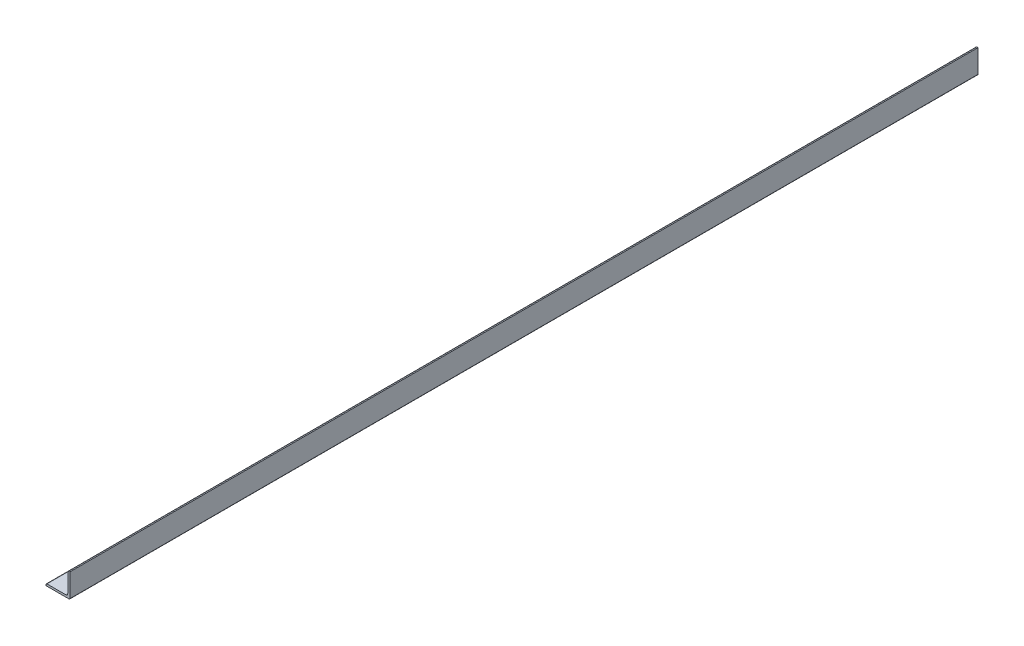
ISO-10303-21;
HEADER;
FILE_DESCRIPTION(('STEP AP214'),'2;1');
FILE_NAME('part.step','',(''),(''),'','','');
FILE_SCHEMA(('AUTOMOTIVE_DESIGN { 1 0 10303 214 1 1 1 1 }'));
ENDSEC;
DATA;
#1=APPLICATION_CONTEXT('core data for automotive mechanical design processes');
#2=APPLICATION_PROTOCOL_DEFINITION('international standard','automotive_design',2000,#1);
#3=PRODUCT_CONTEXT('',#1,'mechanical');
#4=PRODUCT('Part','Part','',(#3));
#5=PRODUCT_RELATED_PRODUCT_CATEGORY('part','',(#4));
#6=PRODUCT_DEFINITION_FORMATION('','',#4);
#7=PRODUCT_DEFINITION_CONTEXT('part definition',#1,'design');
#8=PRODUCT_DEFINITION('design','',#6,#7);
#9=PRODUCT_DEFINITION_SHAPE('','',#8);
#10=(LENGTH_UNIT() NAMED_UNIT(*) SI_UNIT(.MILLI.,.METRE.));
#11=(NAMED_UNIT(*) PLANE_ANGLE_UNIT() SI_UNIT($,.RADIAN.));
#12=(NAMED_UNIT(*) SI_UNIT($,.STERADIAN.) SOLID_ANGLE_UNIT());
#13=UNCERTAINTY_MEASURE_WITH_UNIT(LENGTH_MEASURE(1.E-05),#10,'distance_accuracy_value','');
#14=(GEOMETRIC_REPRESENTATION_CONTEXT(3) GLOBAL_UNCERTAINTY_ASSIGNED_CONTEXT((#13)) GLOBAL_UNIT_ASSIGNED_CONTEXT((#10,
#11,#12)) REPRESENTATION_CONTEXT('',''));
#15=CARTESIAN_POINT('',(0.,0.,0.));
#16=DIRECTION('',(0.,0.,1.));
#17=DIRECTION('',(1.,0.,0.));
#18=AXIS2_PLACEMENT_3D('',#15,#16,#17);
#19=CARTESIAN_POINT('',(0.,0.,668.));
#20=DIRECTION('',(0.,-1.,0.));
#21=DIRECTION('',(1.,0.,0.));
#22=AXIS2_PLACEMENT_3D('',#19,#20,#21);
#23=PLANE('',#22);
#24=DIRECTION('',(0.,0.,-1.));
#25=VECTOR('',#24,1.);
#26=CARTESIAN_POINT('',(-35.,0.,668.));
#27=LINE('',#26,#25);
#28=CARTESIAN_POINT('',(-35.,0.,668.));
#29=VERTEX_POINT('',#28);
#30=CARTESIAN_POINT('',(-35.,0.,-668.));
#31=VERTEX_POINT('',#30);
#32=EDGE_CURVE('E135',#29,#31,#27,.T.);
#33=ORIENTED_EDGE('',*,*,#32,.T.);
#34=DIRECTION('',(-1.,0.,0.));
#35=VECTOR('',#34,1.);
#36=CARTESIAN_POINT('',(0.,0.,-668.));
#37=LINE('',#36,#35);
#38=CARTESIAN_POINT('',(-1.00000000000001,0.,-668.));
#39=VERTEX_POINT('',#38);
#40=EDGE_CURVE('E129',#39,#31,#37,.T.);
#41=ORIENTED_EDGE('',*,*,#40,.F.);
#42=DIRECTION('',(0.,0.,-1.));
#43=VECTOR('',#42,1.);
#44=CARTESIAN_POINT('',(-1.00000000000001,0.,668.));
#45=LINE('',#44,#43);
#46=CARTESIAN_POINT('',(-1.00000000000001,0.,668.));
#47=VERTEX_POINT('',#46);
#48=EDGE_CURVE('E110',#47,#39,#45,.T.);
#49=ORIENTED_EDGE('',*,*,#48,.F.);
#50=DIRECTION('',(-1.,0.,0.));
#51=VECTOR('',#50,1.);
#52=CARTESIAN_POINT('',(0.,0.,668.));
#53=LINE('',#52,#51);
#54=EDGE_CURVE('E159',#47,#29,#53,.T.);
#55=ORIENTED_EDGE('',*,*,#54,.T.);
#56=EDGE_LOOP('',(#33,#41,#49,#55));
#57=FACE_BOUND('',#56,.T.);
#58=ADVANCED_FACE('F34',(#57),#23,.T.);
#59=CARTESIAN_POINT('',(-1.,1.,668.));
#60=DIRECTION('',(0.,0.,-1.));
#61=DIRECTION('',(-1.,0.,0.));
#62=AXIS2_PLACEMENT_3D('',#59,#60,#61);
#63=CYLINDRICAL_SURFACE('',#62,1.);
#64=ORIENTED_EDGE('',*,*,#48,.T.);
#65=CARTESIAN_POINT('',(-1.,1.,-668.));
#66=DIRECTION('',(0.,0.,1.));
#67=DIRECTION('',(1.,0.,0.));
#68=AXIS2_PLACEMENT_3D('',#65,#66,#67);
#69=CIRCLE('',#68,1.);
#70=CARTESIAN_POINT('',(0.,1.00000000000001,-668.));
#71=VERTEX_POINT('',#70);
#72=EDGE_CURVE('E114',#39,#71,#69,.T.);
#73=ORIENTED_EDGE('',*,*,#72,.T.);
#74=DIRECTION('',(0.,0.,-1.));
#75=VECTOR('',#74,1.);
#76=CARTESIAN_POINT('',(0.,1.00000000000001,668.));
#77=LINE('',#76,#75);
#78=CARTESIAN_POINT('',(0.,1.00000000000001,668.));
#79=VERTEX_POINT('',#78);
#80=EDGE_CURVE('E121',#79,#71,#77,.T.);
#81=ORIENTED_EDGE('',*,*,#80,.F.);
#82=CARTESIAN_POINT('',(-1.,1.,668.));
#83=DIRECTION('',(0.,0.,1.));
#84=DIRECTION('',(1.,0.,0.));
#85=AXIS2_PLACEMENT_3D('',#82,#83,#84);
#86=CIRCLE('',#85,1.);
#87=EDGE_CURVE('E115',#47,#79,#86,.T.);
#88=ORIENTED_EDGE('',*,*,#87,.F.);
#89=EDGE_LOOP('',(#64,#73,#81,#88));
#90=FACE_BOUND('',#89,.T.);
#91=ADVANCED_FACE('F112',(#90),#63,.T.);
#92=CARTESIAN_POINT('',(0.,0.,668.));
#93=DIRECTION('',(-1.,0.,0.));
#94=DIRECTION('',(0.,0.,1.));
#95=AXIS2_PLACEMENT_3D('',#92,#93,#94);
#96=PLANE('',#95);
#97=ORIENTED_EDGE('',*,*,#80,.T.);
#98=DIRECTION('',(0.,1.,0.));
#99=VECTOR('',#98,1.);
#100=CARTESIAN_POINT('',(0.,0.,-668.));
#101=LINE('',#100,#99);
#102=CARTESIAN_POINT('',(0.,35.,-668.));
#103=VERTEX_POINT('',#102);
#104=EDGE_CURVE('E132',#71,#103,#101,.T.);
#105=ORIENTED_EDGE('',*,*,#104,.T.);
#106=DIRECTION('',(0.,0.,-1.));
#107=VECTOR('',#106,1.);
#108=CARTESIAN_POINT('',(0.,35.,668.));
#109=LINE('',#108,#107);
#110=CARTESIAN_POINT('',(0.,35.,668.));
#111=VERTEX_POINT('',#110);
#112=EDGE_CURVE('E181',#111,#103,#109,.T.);
#113=ORIENTED_EDGE('',*,*,#112,.F.);
#114=DIRECTION('',(0.,1.,0.));
#115=VECTOR('',#114,1.);
#116=CARTESIAN_POINT('',(0.,0.,668.));
#117=LINE('',#116,#115);
#118=EDGE_CURVE('E162',#79,#111,#117,.T.);
#119=ORIENTED_EDGE('',*,*,#118,.F.);
#120=EDGE_LOOP('',(#97,#105,#113,#119));
#121=FACE_BOUND('',#120,.T.);
#122=ADVANCED_FACE('F222',(#121),#96,.F.);
#123=CARTESIAN_POINT('',(0.,35.,668.));
#124=DIRECTION('',(0.,1.,0.));
#125=DIRECTION('',(0.,0.,1.));
#126=AXIS2_PLACEMENT_3D('',#123,#124,#125);
#127=PLANE('',#126);
#128=ORIENTED_EDGE('',*,*,#112,.T.);
#129=DIRECTION('',(1.,0.,0.));
#130=VECTOR('',#129,1.);
#131=CARTESIAN_POINT('',(0.,35.,-668.));
#132=LINE('',#131,#130);
#133=CARTESIAN_POINT('',(-1.5,35.,-668.));
#134=VERTEX_POINT('',#133);
#135=EDGE_CURVE('E140',#134,#103,#132,.T.);
#136=ORIENTED_EDGE('',*,*,#135,.F.);
#137=DIRECTION('',(0.,0.,-1.));
#138=VECTOR('',#137,1.);
#139=CARTESIAN_POINT('',(-1.5,35.,668.));
#140=LINE('',#139,#138);
#141=CARTESIAN_POINT('',(-1.5,35.,668.));
#142=VERTEX_POINT('',#141);
#143=EDGE_CURVE('E11',#134,#142,#140,.F.);
#144=ORIENTED_EDGE('',*,*,#143,.T.);
#145=DIRECTION('',(1.,0.,0.));
#146=VECTOR('',#145,1.);
#147=CARTESIAN_POINT('',(0.,35.,668.));
#148=LINE('',#147,#146);
#149=EDGE_CURVE('E165',#142,#111,#148,.T.);
#150=ORIENTED_EDGE('',*,*,#149,.T.);
#151=EDGE_LOOP('',(#128,#136,#144,#150));
#152=FACE_BOUND('',#151,.T.);
#153=ADVANCED_FACE('F227',(#152),#127,.T.);
#154=CARTESIAN_POINT('',(-3.,0.,668.));
#155=DIRECTION('',(-1.,0.,0.));
#156=DIRECTION('',(0.,-1.,0.));
#157=AXIS2_PLACEMENT_3D('',#154,#155,#156);
#158=PLANE('',#157);
#159=DIRECTION('',(0.,1.,0.));
#160=VECTOR('',#159,1.);
#161=CARTESIAN_POINT('',(-3.,0.,668.));
#162=LINE('',#161,#160);
#163=CARTESIAN_POINT('',(-3.,6.00000000000002,668.));
#164=VERTEX_POINT('',#163);
#165=CARTESIAN_POINT('',(-3.,33.5,668.));
#166=VERTEX_POINT('',#165);
#167=EDGE_CURVE('E167',#164,#166,#162,.T.);
#168=ORIENTED_EDGE('',*,*,#167,.T.);
#169=DIRECTION('',(0.,0.,-1.));
#170=VECTOR('',#169,1.);
#171=CARTESIAN_POINT('',(-3.,33.5,668.));
#172=LINE('',#171,#170);
#173=CARTESIAN_POINT('',(-3.,33.5,-668.));
#174=VERTEX_POINT('',#173);
#175=EDGE_CURVE('E42',#166,#174,#172,.T.);
#176=ORIENTED_EDGE('',*,*,#175,.T.);
#177=DIRECTION('',(0.,1.,0.));
#178=VECTOR('',#177,1.);
#179=CARTESIAN_POINT('',(-3.,0.,-668.));
#180=LINE('',#179,#178);
#181=CARTESIAN_POINT('',(-3.,6.00000000000002,-668.));
#182=VERTEX_POINT('',#181);
#183=EDGE_CURVE('E142',#182,#174,#180,.T.);
#184=ORIENTED_EDGE('',*,*,#183,.F.);
#185=DIRECTION('',(0.,0.,-1.));
#186=VECTOR('',#185,1.);
#187=CARTESIAN_POINT('',(-3.,6.00000000000002,668.));
#188=LINE('',#187,#186);
#189=EDGE_CURVE('E179',#164,#182,#188,.T.);
#190=ORIENTED_EDGE('',*,*,#189,.F.);
#191=EDGE_LOOP('',(#168,#176,#184,#190));
#192=FACE_BOUND('',#191,.T.);
#193=ADVANCED_FACE('F192',(#192),#158,.T.);
#194=CARTESIAN_POINT('',(-6.,6.,668.));
#195=DIRECTION('',(0.,0.,-1.));
#196=DIRECTION('',(-1.,0.,0.));
#197=AXIS2_PLACEMENT_3D('',#194,#195,#196);
#198=CYLINDRICAL_SURFACE('',#197,3.);
#199=ORIENTED_EDGE('',*,*,#189,.T.);
#200=CARTESIAN_POINT('',(-6.,6.,-668.));
#201=DIRECTION('',(0.,0.,1.));
#202=DIRECTION('',(1.,0.,0.));
#203=AXIS2_PLACEMENT_3D('',#200,#201,#202);
#204=CIRCLE('',#203,3.);
#205=CARTESIAN_POINT('',(-6.00000000000002,3.,-668.));
#206=VERTEX_POINT('',#205);
#207=EDGE_CURVE('E145',#182,#206,#204,.F.);
#208=ORIENTED_EDGE('',*,*,#207,.T.);
#209=DIRECTION('',(0.,0.,-1.));
#210=VECTOR('',#209,1.);
#211=CARTESIAN_POINT('',(-6.00000000000002,3.,668.));
#212=LINE('',#211,#210);
#213=CARTESIAN_POINT('',(-6.00000000000002,3.,668.));
#214=VERTEX_POINT('',#213);
#215=EDGE_CURVE('E177',#214,#206,#212,.T.);
#216=ORIENTED_EDGE('',*,*,#215,.F.);
#217=CARTESIAN_POINT('',(-6.,6.,668.));
#218=DIRECTION('',(0.,0.,1.));
#219=DIRECTION('',(1.,0.,0.));
#220=AXIS2_PLACEMENT_3D('',#217,#218,#219);
#221=CIRCLE('',#220,3.);
#222=EDGE_CURVE('E169',#164,#214,#221,.F.);
#223=ORIENTED_EDGE('',*,*,#222,.F.);
#224=EDGE_LOOP('',(#199,#208,#216,#223));
#225=FACE_BOUND('',#224,.T.);
#226=ADVANCED_FACE('F199',(#225),#198,.F.);
#227=CARTESIAN_POINT('',(0.,3.,668.));
#228=DIRECTION('',(0.,-1.,0.));
#229=DIRECTION('',(1.,0.,0.));
#230=AXIS2_PLACEMENT_3D('',#227,#228,#229);
#231=PLANE('',#230);
#232=ORIENTED_EDGE('',*,*,#215,.T.);
#233=DIRECTION('',(-1.,0.,0.));
#234=VECTOR('',#233,1.);
#235=CARTESIAN_POINT('',(0.,3.,-668.));
#236=LINE('',#235,#234);
#237=CARTESIAN_POINT('',(-33.5,3.,-668.));
#238=VERTEX_POINT('',#237);
#239=EDGE_CURVE('E148',#206,#238,#236,.T.);
#240=ORIENTED_EDGE('',*,*,#239,.T.);
#241=DIRECTION('',(0.,0.,-1.));
#242=VECTOR('',#241,1.);
#243=CARTESIAN_POINT('',(-33.5,3.,668.));
#244=LINE('',#243,#242);
#245=CARTESIAN_POINT('',(-33.5,3.,668.));
#246=VERTEX_POINT('',#245);
#247=EDGE_CURVE('E185',#238,#246,#244,.F.);
#248=ORIENTED_EDGE('',*,*,#247,.T.);
#249=DIRECTION('',(-1.,0.,0.));
#250=VECTOR('',#249,1.);
#251=CARTESIAN_POINT('',(0.,3.,668.));
#252=LINE('',#251,#250);
#253=EDGE_CURVE('E171',#214,#246,#252,.T.);
#254=ORIENTED_EDGE('',*,*,#253,.F.);
#255=EDGE_LOOP('',(#232,#240,#248,#254));
#256=FACE_BOUND('',#255,.T.);
#257=ADVANCED_FACE('F213',(#256),#231,.F.);
#258=CARTESIAN_POINT('',(-35.,0.,668.));
#259=DIRECTION('',(1.,0.,0.));
#260=DIRECTION('',(0.,0.,-1.));
#261=AXIS2_PLACEMENT_3D('',#258,#259,#260);
#262=PLANE('',#261);
#263=DIRECTION('',(0.,-1.,0.));
#264=VECTOR('',#263,1.);
#265=CARTESIAN_POINT('',(-35.,0.,668.));
#266=LINE('',#265,#264);
#267=CARTESIAN_POINT('',(-35.,1.5,668.));
#268=VERTEX_POINT('',#267);
#269=EDGE_CURVE('E174',#268,#29,#266,.T.);
#270=ORIENTED_EDGE('',*,*,#269,.F.);
#271=DIRECTION('',(0.,0.,-1.));
#272=VECTOR('',#271,1.);
#273=CARTESIAN_POINT('',(-35.,1.5,668.));
#274=LINE('',#273,#272);
#275=CARTESIAN_POINT('',(-35.,1.5,-668.));
#276=VERTEX_POINT('',#275);
#277=EDGE_CURVE('E120',#268,#276,#274,.T.);
#278=ORIENTED_EDGE('',*,*,#277,.T.);
#279=DIRECTION('',(0.,-1.,0.));
#280=VECTOR('',#279,1.);
#281=CARTESIAN_POINT('',(-35.,0.,-668.));
#282=LINE('',#281,#280);
#283=EDGE_CURVE('E151',#276,#31,#282,.T.);
#284=ORIENTED_EDGE('',*,*,#283,.T.);
#285=ORIENTED_EDGE('',*,*,#32,.F.);
#286=EDGE_LOOP('',(#270,#278,#284,#285));
#287=FACE_BOUND('',#286,.T.);
#288=ADVANCED_FACE('F206',(#287),#262,.F.);
#289=CARTESIAN_POINT('',(0.,0.,668.));
#290=DIRECTION('',(0.,0.,1.));
#291=DIRECTION('',(1.,0.,0.));
#292=AXIS2_PLACEMENT_3D('',#289,#290,#291);
#293=PLANE('',#292);
#294=ORIENTED_EDGE('',*,*,#253,.T.);
#295=CARTESIAN_POINT('',(-33.5,1.5,668.));
#296=DIRECTION('',(0.,0.,1.));
#297=DIRECTION('',(1.,0.,0.));
#298=AXIS2_PLACEMENT_3D('',#295,#296,#297);
#299=CIRCLE('',#298,1.5);
#300=EDGE_CURVE('E188',#246,#268,#299,.T.);
#301=ORIENTED_EDGE('',*,*,#300,.T.);
#302=ORIENTED_EDGE('',*,*,#269,.T.);
#303=ORIENTED_EDGE('',*,*,#54,.F.);
#304=ORIENTED_EDGE('',*,*,#87,.T.);
#305=ORIENTED_EDGE('',*,*,#118,.T.);
#306=ORIENTED_EDGE('',*,*,#149,.F.);
#307=CARTESIAN_POINT('',(-1.5,33.5,668.));
#308=DIRECTION('',(0.,0.,1.));
#309=DIRECTION('',(1.,0.,0.));
#310=AXIS2_PLACEMENT_3D('',#307,#308,#309);
#311=CIRCLE('',#310,1.5);
#312=EDGE_CURVE('E49',#142,#166,#311,.T.);
#313=ORIENTED_EDGE('',*,*,#312,.T.);
#314=ORIENTED_EDGE('',*,*,#167,.F.);
#315=ORIENTED_EDGE('',*,*,#222,.T.);
#316=EDGE_LOOP('',(#294,#301,#302,#303,#304,#305,#306,#313,#314,#315));
#317=FACE_BOUND('',#316,.T.);
#318=ADVANCED_FACE('F202',(#317),#293,.T.);
#319=CARTESIAN_POINT('',(-33.5,1.5,668.));
#320=DIRECTION('',(0.,0.,-1.));
#321=DIRECTION('',(-1.,0.,0.));
#322=AXIS2_PLACEMENT_3D('',#319,#320,#321);
#323=CYLINDRICAL_SURFACE('',#322,1.5);
#324=ORIENTED_EDGE('',*,*,#300,.F.);
#325=ORIENTED_EDGE('',*,*,#247,.F.);
#326=CARTESIAN_POINT('',(-33.5,1.5,-668.));
#327=DIRECTION('',(0.,0.,1.));
#328=DIRECTION('',(1.,0.,0.));
#329=AXIS2_PLACEMENT_3D('',#326,#327,#328);
#330=CIRCLE('',#329,1.5);
#331=EDGE_CURVE('E156',#238,#276,#330,.T.);
#332=ORIENTED_EDGE('',*,*,#331,.T.);
#333=ORIENTED_EDGE('',*,*,#277,.F.);
#334=EDGE_LOOP('',(#324,#325,#332,#333));
#335=FACE_BOUND('',#334,.T.);
#336=ADVANCED_FACE('F205',(#335),#323,.T.);
#337=CARTESIAN_POINT('',(-1.5,33.5,668.));
#338=DIRECTION('',(0.,0.,-1.));
#339=DIRECTION('',(-1.,0.,0.));
#340=AXIS2_PLACEMENT_3D('',#337,#338,#339);
#341=CYLINDRICAL_SURFACE('',#340,1.5);
#342=ORIENTED_EDGE('',*,*,#312,.F.);
#343=ORIENTED_EDGE('',*,*,#143,.F.);
#344=CARTESIAN_POINT('',(-1.5,33.5,-668.));
#345=DIRECTION('',(0.,0.,1.));
#346=DIRECTION('',(1.,0.,0.));
#347=AXIS2_PLACEMENT_3D('',#344,#345,#346);
#348=CIRCLE('',#347,1.5);
#349=EDGE_CURVE('E153',#134,#174,#348,.T.);
#350=ORIENTED_EDGE('',*,*,#349,.T.);
#351=ORIENTED_EDGE('',*,*,#175,.F.);
#352=EDGE_LOOP('',(#342,#343,#350,#351));
#353=FACE_BOUND('',#352,.T.);
#354=ADVANCED_FACE('F36',(#353),#341,.T.);
#355=CARTESIAN_POINT('',(0.,0.,-668.));
#356=DIRECTION('',(0.,0.,-1.));
#357=DIRECTION('',(1.,0.,0.));
#358=AXIS2_PLACEMENT_3D('',#355,#356,#357);
#359=PLANE('',#358);
#360=ORIENTED_EDGE('',*,*,#239,.F.);
#361=ORIENTED_EDGE('',*,*,#207,.F.);
#362=ORIENTED_EDGE('',*,*,#183,.T.);
#363=ORIENTED_EDGE('',*,*,#349,.F.);
#364=ORIENTED_EDGE('',*,*,#135,.T.);
#365=ORIENTED_EDGE('',*,*,#104,.F.);
#366=ORIENTED_EDGE('',*,*,#72,.F.);
#367=ORIENTED_EDGE('',*,*,#40,.T.);
#368=ORIENTED_EDGE('',*,*,#283,.F.);
#369=ORIENTED_EDGE('',*,*,#331,.F.);
#370=EDGE_LOOP('',(#360,#361,#362,#363,#364,#365,#366,#367,#368,#369));
#371=FACE_BOUND('',#370,.T.);
#372=ADVANCED_FACE('F127',(#371),#359,.T.);
#373=CLOSED_SHELL('',(#58,#91,#122,#153,#193,#226,#257,#288,#318,#336,#354,#372));
#374=MANIFOLD_SOLID_BREP('B2',#373);
#375=ADVANCED_BREP_SHAPE_REPRESENTATION('',(#18,#374),#14);
#376=SHAPE_DEFINITION_REPRESENTATION(#9,#375);
ENDSEC;
END-ISO-10303-21;
